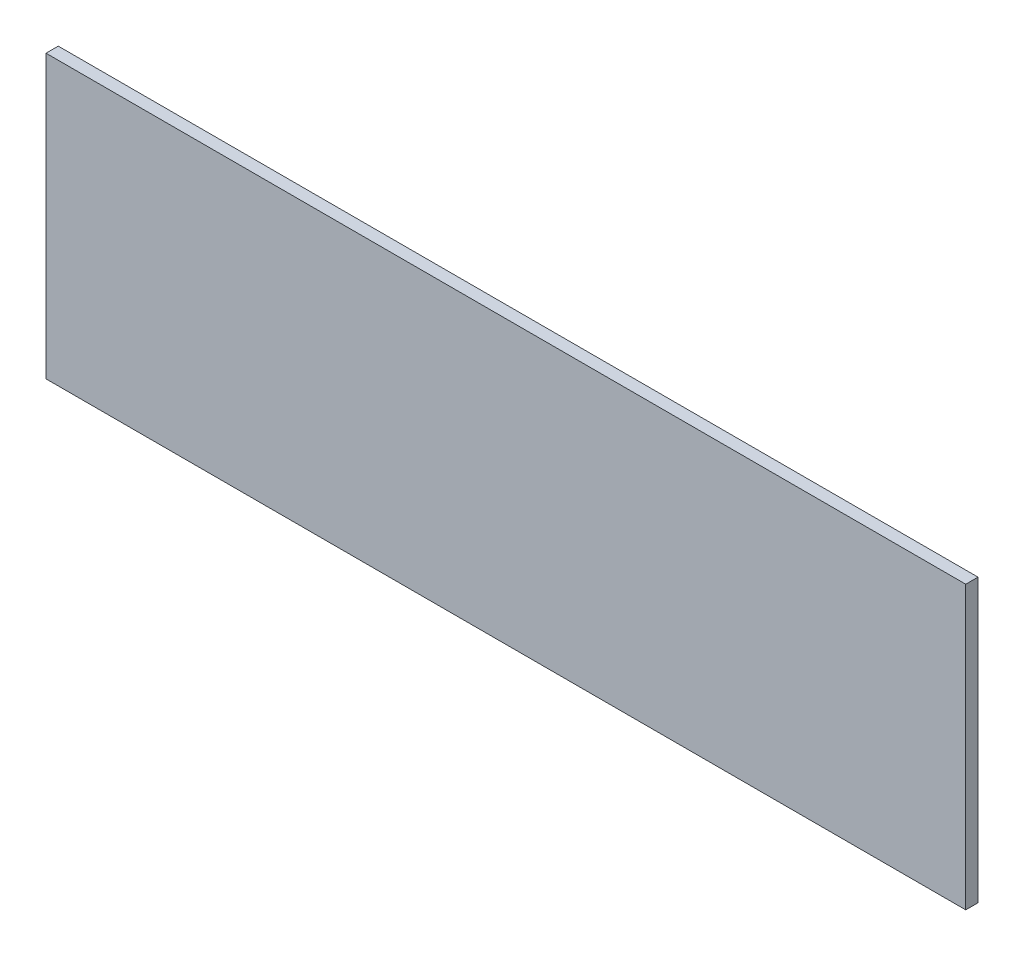
ISO-10303-21;
HEADER;
FILE_DESCRIPTION(('STEP AP214'),'2;1');
FILE_NAME('part.step','',(''),(''),'','','');
FILE_SCHEMA(('AUTOMOTIVE_DESIGN { 1 0 10303 214 1 1 1 1 }'));
ENDSEC;
DATA;
#1=APPLICATION_CONTEXT('core data for automotive mechanical design processes');
#2=APPLICATION_PROTOCOL_DEFINITION('international standard','automotive_design',2000,#1);
#3=PRODUCT_CONTEXT('',#1,'mechanical');
#4=PRODUCT('Part','Part','',(#3));
#5=PRODUCT_RELATED_PRODUCT_CATEGORY('part','',(#4));
#6=PRODUCT_DEFINITION_FORMATION('','',#4);
#7=PRODUCT_DEFINITION_CONTEXT('part definition',#1,'design');
#8=PRODUCT_DEFINITION('design','',#6,#7);
#9=PRODUCT_DEFINITION_SHAPE('','',#8);
#10=(LENGTH_UNIT() NAMED_UNIT(*) SI_UNIT(.MILLI.,.METRE.));
#11=(NAMED_UNIT(*) PLANE_ANGLE_UNIT() SI_UNIT($,.RADIAN.));
#12=(NAMED_UNIT(*) SI_UNIT($,.STERADIAN.) SOLID_ANGLE_UNIT());
#13=UNCERTAINTY_MEASURE_WITH_UNIT(LENGTH_MEASURE(1.E-05),#10,'distance_accuracy_value','');
#14=(GEOMETRIC_REPRESENTATION_CONTEXT(3) GLOBAL_UNCERTAINTY_ASSIGNED_CONTEXT((#13)) GLOBAL_UNIT_ASSIGNED_CONTEXT((#10,
#11,#12)) REPRESENTATION_CONTEXT('',''));
#15=CARTESIAN_POINT('',(0.,0.,0.));
#16=DIRECTION('',(0.,0.,1.));
#17=DIRECTION('',(1.,0.,0.));
#18=AXIS2_PLACEMENT_3D('',#15,#16,#17);
#19=CARTESIAN_POINT('',(0.,0.,12.));
#20=DIRECTION('',(0.,1.,0.));
#21=DIRECTION('',(0.,0.,1.));
#22=AXIS2_PLACEMENT_3D('',#19,#20,#21);
#23=PLANE('',#22);
#24=DIRECTION('',(1.,0.,0.));
#25=VECTOR('',#24,1.);
#26=CARTESIAN_POINT('',(0.,0.,0.));
#27=LINE('',#26,#25);
#28=CARTESIAN_POINT('',(0.,0.,0.));
#29=VERTEX_POINT('',#28);
#30=CARTESIAN_POINT('',(900.000000000004,0.,0.));
#31=VERTEX_POINT('',#30);
#32=EDGE_CURVE('E91',#29,#31,#27,.T.);
#33=ORIENTED_EDGE('',*,*,#32,.T.);
#34=DIRECTION('',(0.,0.,-1.));
#35=VECTOR('',#34,1.);
#36=CARTESIAN_POINT('',(900.000000000004,1.77635683940025E-12,11.9999999999999));
#37=LINE('',#36,#35);
#38=CARTESIAN_POINT('',(900.000000000004,1.77635683940025E-12,11.9999999999999));
#39=VERTEX_POINT('',#38);
#40=EDGE_CURVE('E11',#39,#31,#37,.T.);
#41=ORIENTED_EDGE('',*,*,#40,.F.);
#42=DIRECTION('',(1.,0.,0.));
#43=VECTOR('',#42,1.);
#44=CARTESIAN_POINT('',(0.,0.,12.));
#45=LINE('',#44,#43);
#46=CARTESIAN_POINT('',(0.,0.,12.));
#47=VERTEX_POINT('',#46);
#48=EDGE_CURVE('E77',#47,#39,#45,.T.);
#49=ORIENTED_EDGE('',*,*,#48,.F.);
#50=DIRECTION('',(0.,0.,-1.));
#51=VECTOR('',#50,1.);
#52=CARTESIAN_POINT('',(0.,0.,12.));
#53=LINE('',#52,#51);
#54=EDGE_CURVE('E44',#47,#29,#53,.T.);
#55=ORIENTED_EDGE('',*,*,#54,.T.);
#56=EDGE_LOOP('',(#33,#41,#49,#55));
#57=FACE_BOUND('',#56,.T.);
#58=ADVANCED_FACE('F28',(#57),#23,.F.);
#59=CARTESIAN_POINT('',(900.000000000004,1.77635683940025E-12,11.9999999999999));
#60=DIRECTION('',(-1.,0.,0.));
#61=DIRECTION('',(0.,0.,1.));
#62=AXIS2_PLACEMENT_3D('',#59,#60,#61);
#63=PLANE('',#62);
#64=DIRECTION('',(0.,1.,0.));
#65=VECTOR('',#64,1.);
#66=CARTESIAN_POINT('',(900.000000000004,0.,0.));
#67=LINE('',#66,#65);
#68=CARTESIAN_POINT('',(900.000000000004,276.,0.));
#69=VERTEX_POINT('',#68);
#70=EDGE_CURVE('E82',#31,#69,#67,.T.);
#71=ORIENTED_EDGE('',*,*,#70,.T.);
#72=DIRECTION('',(0.,0.,-1.));
#73=VECTOR('',#72,1.);
#74=CARTESIAN_POINT('',(900.000000000004,276.,12.));
#75=LINE('',#74,#73);
#76=CARTESIAN_POINT('',(900.000000000004,276.,12.));
#77=VERTEX_POINT('',#76);
#78=EDGE_CURVE('E36',#77,#69,#75,.T.);
#79=ORIENTED_EDGE('',*,*,#78,.F.);
#80=DIRECTION('',(0.,1.,0.));
#81=VECTOR('',#80,1.);
#82=CARTESIAN_POINT('',(900.000000000004,1.77635683940025E-12,11.9999999999999));
#83=LINE('',#82,#81);
#84=EDGE_CURVE('E69',#39,#77,#83,.T.);
#85=ORIENTED_EDGE('',*,*,#84,.F.);
#86=ORIENTED_EDGE('',*,*,#40,.T.);
#87=EDGE_LOOP('',(#71,#79,#85,#86));
#88=FACE_BOUND('',#87,.T.);
#89=ADVANCED_FACE('F81',(#88),#63,.F.);
#90=CARTESIAN_POINT('',(0.,276.,12.));
#91=DIRECTION('',(0.,1.,0.));
#92=DIRECTION('',(0.,0.,1.));
#93=AXIS2_PLACEMENT_3D('',#90,#91,#92);
#94=PLANE('',#93);
#95=DIRECTION('',(1.,0.,0.));
#96=VECTOR('',#95,1.);
#97=CARTESIAN_POINT('',(0.,276.,0.));
#98=LINE('',#97,#96);
#99=CARTESIAN_POINT('',(0.,276.,0.));
#100=VERTEX_POINT('',#99);
#101=EDGE_CURVE('E94',#100,#69,#98,.T.);
#102=ORIENTED_EDGE('',*,*,#101,.F.);
#103=DIRECTION('',(0.,0.,-1.));
#104=VECTOR('',#103,1.);
#105=CARTESIAN_POINT('',(0.,276.,12.));
#106=LINE('',#105,#104);
#107=CARTESIAN_POINT('',(0.,276.,12.));
#108=VERTEX_POINT('',#107);
#109=EDGE_CURVE('E58',#108,#100,#106,.T.);
#110=ORIENTED_EDGE('',*,*,#109,.F.);
#111=DIRECTION('',(1.,0.,0.));
#112=VECTOR('',#111,1.);
#113=CARTESIAN_POINT('',(0.,276.,12.));
#114=LINE('',#113,#112);
#115=EDGE_CURVE('E76',#108,#77,#114,.T.);
#116=ORIENTED_EDGE('',*,*,#115,.T.);
#117=ORIENTED_EDGE('',*,*,#78,.T.);
#118=EDGE_LOOP('',(#102,#110,#116,#117));
#119=FACE_BOUND('',#118,.T.);
#120=ADVANCED_FACE('F85',(#119),#94,.T.);
#121=CARTESIAN_POINT('',(0.,0.,12.));
#122=DIRECTION('',(-1.,0.,0.));
#123=DIRECTION('',(0.,0.,1.));
#124=AXIS2_PLACEMENT_3D('',#121,#122,#123);
#125=PLANE('',#124);
#126=DIRECTION('',(0.,1.,0.));
#127=VECTOR('',#126,1.);
#128=CARTESIAN_POINT('',(0.,0.,0.));
#129=LINE('',#128,#127);
#130=EDGE_CURVE('E96',#29,#100,#129,.T.);
#131=ORIENTED_EDGE('',*,*,#130,.F.);
#132=ORIENTED_EDGE('',*,*,#54,.F.);
#133=DIRECTION('',(0.,1.,0.));
#134=VECTOR('',#133,1.);
#135=CARTESIAN_POINT('',(0.,0.,12.));
#136=LINE('',#135,#134);
#137=EDGE_CURVE('E86',#47,#108,#136,.T.);
#138=ORIENTED_EDGE('',*,*,#137,.T.);
#139=ORIENTED_EDGE('',*,*,#109,.T.);
#140=EDGE_LOOP('',(#131,#132,#138,#139));
#141=FACE_BOUND('',#140,.T.);
#142=ADVANCED_FACE('F102',(#141),#125,.T.);
#143=CARTESIAN_POINT('',(0.,0.,12.));
#144=DIRECTION('',(0.,0.,1.));
#145=DIRECTION('',(1.,0.,0.));
#146=AXIS2_PLACEMENT_3D('',#143,#144,#145);
#147=PLANE('',#146);
#148=ORIENTED_EDGE('',*,*,#48,.T.);
#149=ORIENTED_EDGE('',*,*,#84,.T.);
#150=ORIENTED_EDGE('',*,*,#115,.F.);
#151=ORIENTED_EDGE('',*,*,#137,.F.);
#152=EDGE_LOOP('',(#148,#149,#150,#151));
#153=FACE_BOUND('',#152,.T.);
#154=ADVANCED_FACE('F73',(#153),#147,.T.);
#155=CARTESIAN_POINT('',(0.,0.,0.));
#156=DIRECTION('',(0.,0.,1.));
#157=DIRECTION('',(1.,0.,0.));
#158=AXIS2_PLACEMENT_3D('',#155,#156,#157);
#159=PLANE('',#158);
#160=ORIENTED_EDGE('',*,*,#32,.F.);
#161=ORIENTED_EDGE('',*,*,#130,.T.);
#162=ORIENTED_EDGE('',*,*,#101,.T.);
#163=ORIENTED_EDGE('',*,*,#70,.F.);
#164=EDGE_LOOP('',(#160,#161,#162,#163));
#165=FACE_BOUND('',#164,.T.);
#166=ADVANCED_FACE('F101',(#165),#159,.F.);
#167=CLOSED_SHELL('',(#58,#89,#120,#142,#154,#166));
#168=MANIFOLD_SOLID_BREP('B2',#167);
#169=ADVANCED_BREP_SHAPE_REPRESENTATION('',(#18,#168),#14);
#170=SHAPE_DEFINITION_REPRESENTATION(#9,#169);
ENDSEC;
END-ISO-10303-21;
